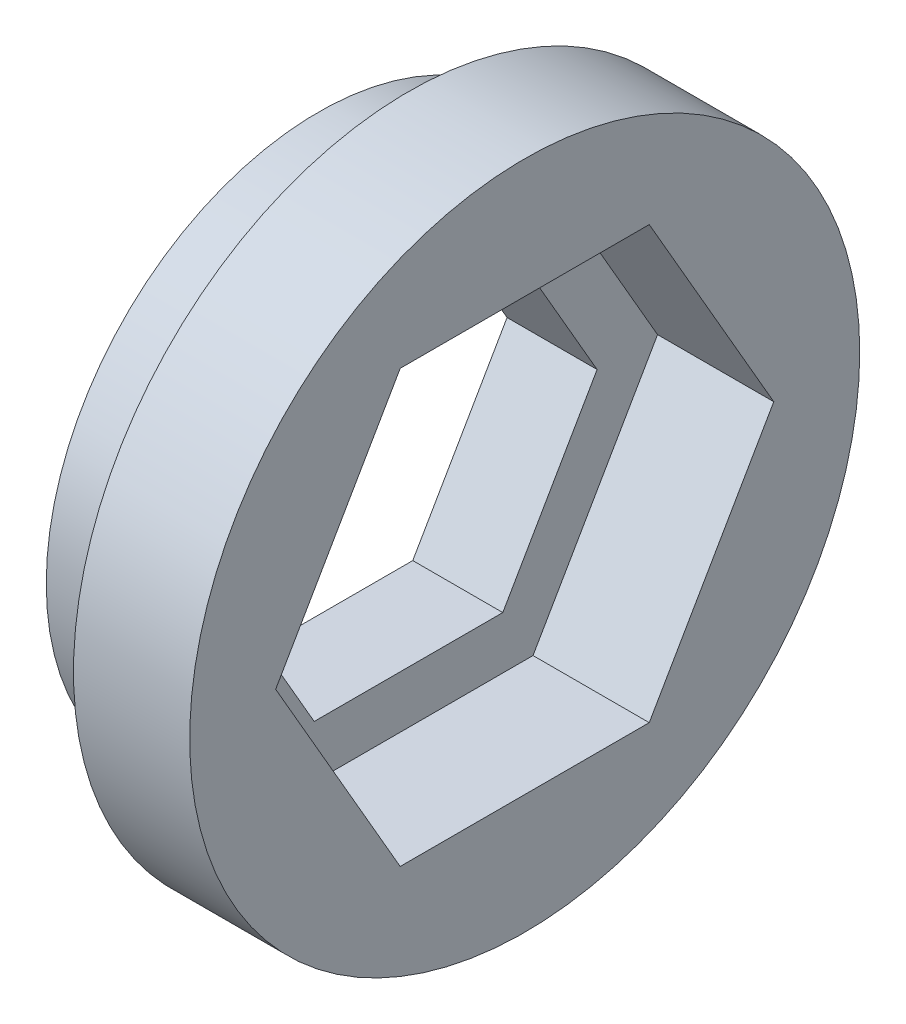
ISO-10303-21;
HEADER;
FILE_DESCRIPTION(('STEP AP214'),'2;1');
FILE_NAME('part.step','',(''),(''),'','','');
FILE_SCHEMA(('AUTOMOTIVE_DESIGN { 1 0 10303 214 1 1 1 1 }'));
ENDSEC;
DATA;
#1=APPLICATION_CONTEXT('core data for automotive mechanical design processes');
#2=APPLICATION_PROTOCOL_DEFINITION('international standard','automotive_design',2000,#1);
#3=PRODUCT_CONTEXT('',#1,'mechanical');
#4=PRODUCT('Part','Part','',(#3));
#5=PRODUCT_RELATED_PRODUCT_CATEGORY('part','',(#4));
#6=PRODUCT_DEFINITION_FORMATION('','',#4);
#7=PRODUCT_DEFINITION_CONTEXT('part definition',#1,'design');
#8=PRODUCT_DEFINITION('design','',#6,#7);
#9=PRODUCT_DEFINITION_SHAPE('','',#8);
#10=(LENGTH_UNIT() NAMED_UNIT(*) SI_UNIT(.MILLI.,.METRE.));
#11=(NAMED_UNIT(*) PLANE_ANGLE_UNIT() SI_UNIT($,.RADIAN.));
#12=(NAMED_UNIT(*) SI_UNIT($,.STERADIAN.) SOLID_ANGLE_UNIT());
#13=UNCERTAINTY_MEASURE_WITH_UNIT(LENGTH_MEASURE(1.E-05),#10,'distance_accuracy_value','');
#14=(GEOMETRIC_REPRESENTATION_CONTEXT(3) GLOBAL_UNCERTAINTY_ASSIGNED_CONTEXT((#13)) GLOBAL_UNIT_ASSIGNED_CONTEXT((#10,
#11,#12)) REPRESENTATION_CONTEXT('',''));
#15=CARTESIAN_POINT('',(0.,0.,0.));
#16=DIRECTION('',(0.,0.,1.));
#17=DIRECTION('',(1.,0.,0.));
#18=AXIS2_PLACEMENT_3D('',#15,#16,#17);
#19=CARTESIAN_POINT('',(1.762125,0.,0.));
#20=DIRECTION('',(1.,0.,0.));
#21=DIRECTION('',(0.,0.,-1.));
#22=AXIS2_PLACEMENT_3D('',#19,#20,#21);
#23=PLANE('',#22);
#24=CARTESIAN_POINT('',(1.762125,0.,0.));
#25=DIRECTION('',(1.,0.,0.));
#26=DIRECTION('',(0.,0.,-1.));
#27=AXIS2_PLACEMENT_3D('',#24,#25,#26);
#28=CIRCLE('',#27,10.16);
#29=CARTESIAN_POINT('',(1.762125,0.,-10.16));
#30=VERTEX_POINT('',#29);
#31=EDGE_CURVE('E147',#30,#30,#28,.T.);
#32=ORIENTED_EDGE('',*,*,#31,.T.);
#33=EDGE_LOOP('',(#32));
#34=FACE_BOUND('',#33,.T.);
#35=DIRECTION('',(0.,0.866025403784439,0.5));
#36=VECTOR('',#35,1.);
#37=CARTESIAN_POINT('',(1.762125,0.,-7.55231887126949));
#38=LINE('',#37,#36);
#39=CARTESIAN_POINT('',(1.762125,0.,-7.55231887126949));
#40=VERTEX_POINT('',#39);
#41=CARTESIAN_POINT('',(1.762125,6.5405,-3.77615943563475));
#42=VERTEX_POINT('',#41);
#43=EDGE_CURVE('E106',#40,#42,#38,.T.);
#44=ORIENTED_EDGE('',*,*,#43,.F.);
#45=DIRECTION('',(0.,0.866025403784439,-0.5));
#46=VECTOR('',#45,1.);
#47=CARTESIAN_POINT('',(1.762125,-6.5405,-3.77615943563475));
#48=LINE('',#47,#46);
#49=CARTESIAN_POINT('',(1.762125,-6.5405,-3.77615943563475));
#50=VERTEX_POINT('',#49);
#51=EDGE_CURVE('E85',#50,#40,#48,.T.);
#52=ORIENTED_EDGE('',*,*,#51,.F.);
#53=DIRECTION('',(0.,0.,-1.));
#54=VECTOR('',#53,1.);
#55=CARTESIAN_POINT('',(1.762125,-6.5405,3.77615943563475));
#56=LINE('',#55,#54);
#57=CARTESIAN_POINT('',(1.762125,-6.5405,3.77615943563475));
#58=VERTEX_POINT('',#57);
#59=EDGE_CURVE('E56',#58,#50,#56,.T.);
#60=ORIENTED_EDGE('',*,*,#59,.F.);
#61=DIRECTION('',(0.,-0.866025403784439,-0.5));
#62=VECTOR('',#61,1.);
#63=CARTESIAN_POINT('',(1.762125,0.,7.5523188712695));
#64=LINE('',#63,#62);
#65=CARTESIAN_POINT('',(1.762125,0.,7.5523188712695));
#66=VERTEX_POINT('',#65);
#67=EDGE_CURVE('E117',#66,#58,#64,.T.);
#68=ORIENTED_EDGE('',*,*,#67,.F.);
#69=DIRECTION('',(0.,-0.866025403784439,0.5));
#70=VECTOR('',#69,1.);
#71=CARTESIAN_POINT('',(1.762125,6.5405,3.77615943563475));
#72=LINE('',#71,#70);
#73=CARTESIAN_POINT('',(1.762125,6.5405,3.77615943563475));
#74=VERTEX_POINT('',#73);
#75=EDGE_CURVE('E105',#74,#66,#72,.T.);
#76=ORIENTED_EDGE('',*,*,#75,.F.);
#77=DIRECTION('',(0.,0.,1.));
#78=VECTOR('',#77,1.);
#79=CARTESIAN_POINT('',(1.762125,6.5405,-3.77615943563475));
#80=LINE('',#79,#78);
#81=EDGE_CURVE('E95',#42,#74,#80,.T.);
#82=ORIENTED_EDGE('',*,*,#81,.F.);
#83=EDGE_LOOP('',(#44,#52,#60,#68,#76,#82));
#84=FACE_BOUND('',#83,.T.);
#85=ADVANCED_FACE('F35',(#34,#84),#23,.T.);
#86=CARTESIAN_POINT('',(-1.762125,0.,0.));
#87=DIRECTION('',(1.,0.,0.));
#88=DIRECTION('',(0.,0.,-1.));
#89=AXIS2_PLACEMENT_3D('',#86,#87,#88);
#90=PLANE('',#89);
#91=CARTESIAN_POINT('',(-1.762125,0.,0.));
#92=DIRECTION('',(1.,0.,0.));
#93=DIRECTION('',(0.,0.,-1.));
#94=AXIS2_PLACEMENT_3D('',#91,#92,#93);
#95=CIRCLE('',#94,9.525);
#96=CARTESIAN_POINT('',(-1.762125,0.,-9.525));
#97=VERTEX_POINT('',#96);
#98=EDGE_CURVE('E11',#97,#97,#95,.T.);
#99=ORIENTED_EDGE('',*,*,#98,.T.);
#100=EDGE_LOOP('',(#99));
#101=FACE_BOUND('',#100,.T.);
#102=CARTESIAN_POINT('',(-1.762125,0.,0.));
#103=DIRECTION('',(1.,0.,0.));
#104=DIRECTION('',(0.,0.,-1.));
#105=AXIS2_PLACEMENT_3D('',#102,#103,#104);
#106=CIRCLE('',#105,10.16);
#107=CARTESIAN_POINT('',(-1.762125,0.,-10.16));
#108=VERTEX_POINT('',#107);
#109=EDGE_CURVE('E146',#108,#108,#106,.T.);
#110=ORIENTED_EDGE('',*,*,#109,.F.);
#111=EDGE_LOOP('',(#110));
#112=FACE_BOUND('',#111,.T.);
#113=ADVANCED_FACE('F168',(#101,#112),#90,.F.);
#114=CARTESIAN_POINT('',(1.762125,0.,0.));
#115=DIRECTION('',(-1.,0.,0.));
#116=DIRECTION('',(0.,0.,1.));
#117=AXIS2_PLACEMENT_3D('',#114,#115,#116);
#118=CYLINDRICAL_SURFACE('',#117,10.16);
#119=ORIENTED_EDGE('',*,*,#31,.F.);
#120=EDGE_LOOP('',(#119));
#121=FACE_BOUND('',#120,.T.);
#122=ORIENTED_EDGE('',*,*,#109,.T.);
#123=EDGE_LOOP('',(#122));
#124=FACE_BOUND('',#123,.T.);
#125=ADVANCED_FACE('F174',(#121,#124),#118,.T.);
#126=CARTESIAN_POINT('',(1.762125,-6.5405,-3.77615943563475));
#127=DIRECTION('',(0.,0.5,0.866025403784439));
#128=DIRECTION('',(0.,-0.866025403784439,0.5));
#129=AXIS2_PLACEMENT_3D('',#126,#127,#128);
#130=PLANE('',#129);
#131=DIRECTION('',(0.,0.866025403784439,-0.5));
#132=VECTOR('',#131,1.);
#133=CARTESIAN_POINT('',(-1.762125,-6.5405,-3.77615943563475));
#134=LINE('',#133,#132);
#135=CARTESIAN_POINT('',(-1.762125,-6.5405,-3.77615943563475));
#136=VERTEX_POINT('',#135);
#137=CARTESIAN_POINT('',(-1.762125,0.,-7.55231887126949));
#138=VERTEX_POINT('',#137);
#139=EDGE_CURVE('E124',#136,#138,#134,.T.);
#140=ORIENTED_EDGE('',*,*,#139,.F.);
#141=DIRECTION('',(-1.,0.,0.));
#142=VECTOR('',#141,1.);
#143=CARTESIAN_POINT('',(1.762125,-6.5405,-3.77615943563475));
#144=LINE('',#143,#142);
#145=EDGE_CURVE('E123',#50,#136,#144,.T.);
#146=ORIENTED_EDGE('',*,*,#145,.F.);
#147=ORIENTED_EDGE('',*,*,#51,.T.);
#148=DIRECTION('',(-1.,0.,0.));
#149=VECTOR('',#148,1.);
#150=CARTESIAN_POINT('',(1.762125,0.,-7.55231887126949));
#151=LINE('',#150,#149);
#152=EDGE_CURVE('E144',#40,#138,#151,.T.);
#153=ORIENTED_EDGE('',*,*,#152,.T.);
#154=EDGE_LOOP('',(#140,#146,#147,#153));
#155=FACE_BOUND('',#154,.T.);
#156=ADVANCED_FACE('F178',(#155),#130,.T.);
#157=CARTESIAN_POINT('',(1.762125,0.,-7.55231887126949));
#158=DIRECTION('',(0.,-0.5,0.866025403784438));
#159=DIRECTION('',(0.,-0.866025403784439,-0.5));
#160=AXIS2_PLACEMENT_3D('',#157,#158,#159);
#161=PLANE('',#160);
#162=DIRECTION('',(0.,0.866025403784439,0.5));
#163=VECTOR('',#162,1.);
#164=CARTESIAN_POINT('',(-1.762125,0.,-7.55231887126949));
#165=LINE('',#164,#163);
#166=CARTESIAN_POINT('',(-1.762125,6.5405,-3.77615943563475));
#167=VERTEX_POINT('',#166);
#168=EDGE_CURVE('E127',#138,#167,#165,.T.);
#169=ORIENTED_EDGE('',*,*,#168,.F.);
#170=ORIENTED_EDGE('',*,*,#152,.F.);
#171=ORIENTED_EDGE('',*,*,#43,.T.);
#172=DIRECTION('',(-1.,0.,0.));
#173=VECTOR('',#172,1.);
#174=CARTESIAN_POINT('',(1.762125,6.5405,-3.77615943563475));
#175=LINE('',#174,#173);
#176=EDGE_CURVE('E101',#42,#167,#175,.T.);
#177=ORIENTED_EDGE('',*,*,#176,.T.);
#178=EDGE_LOOP('',(#169,#170,#171,#177));
#179=FACE_BOUND('',#178,.T.);
#180=ADVANCED_FACE('F185',(#179),#161,.T.);
#181=CARTESIAN_POINT('',(1.762125,6.5405,-3.77615943563475));
#182=DIRECTION('',(0.,-1.,0.));
#183=DIRECTION('',(0.,0.,-1.));
#184=AXIS2_PLACEMENT_3D('',#181,#182,#183);
#185=PLANE('',#184);
#186=DIRECTION('',(0.,0.,1.));
#187=VECTOR('',#186,1.);
#188=CARTESIAN_POINT('',(-1.762125,6.5405,-3.77615943563475));
#189=LINE('',#188,#187);
#190=CARTESIAN_POINT('',(-1.762125,6.5405,3.77615943563475));
#191=VERTEX_POINT('',#190);
#192=EDGE_CURVE('E131',#167,#191,#189,.T.);
#193=ORIENTED_EDGE('',*,*,#192,.F.);
#194=ORIENTED_EDGE('',*,*,#176,.F.);
#195=ORIENTED_EDGE('',*,*,#81,.T.);
#196=DIRECTION('',(-1.,0.,0.));
#197=VECTOR('',#196,1.);
#198=CARTESIAN_POINT('',(1.762125,6.5405,3.77615943563475));
#199=LINE('',#198,#197);
#200=EDGE_CURVE('E99',#74,#191,#199,.T.);
#201=ORIENTED_EDGE('',*,*,#200,.T.);
#202=EDGE_LOOP('',(#193,#194,#195,#201));
#203=FACE_BOUND('',#202,.T.);
#204=ADVANCED_FACE('F98',(#203),#185,.T.);
#205=CARTESIAN_POINT('',(1.762125,6.5405,3.77615943563475));
#206=DIRECTION('',(0.,-0.5,-0.866025403784439));
#207=DIRECTION('',(0.,0.866025403784439,-0.5));
#208=AXIS2_PLACEMENT_3D('',#205,#206,#207);
#209=PLANE('',#208);
#210=DIRECTION('',(0.,-0.866025403784439,0.5));
#211=VECTOR('',#210,1.);
#212=CARTESIAN_POINT('',(-1.762125,6.5405,3.77615943563475));
#213=LINE('',#212,#211);
#214=CARTESIAN_POINT('',(-1.762125,0.,7.5523188712695));
#215=VERTEX_POINT('',#214);
#216=EDGE_CURVE('E112',#191,#215,#213,.T.);
#217=ORIENTED_EDGE('',*,*,#216,.F.);
#218=ORIENTED_EDGE('',*,*,#200,.F.);
#219=ORIENTED_EDGE('',*,*,#75,.T.);
#220=DIRECTION('',(-1.,0.,0.));
#221=VECTOR('',#220,1.);
#222=CARTESIAN_POINT('',(1.762125,0.,7.5523188712695));
#223=LINE('',#222,#221);
#224=EDGE_CURVE('E114',#66,#215,#223,.T.);
#225=ORIENTED_EDGE('',*,*,#224,.T.);
#226=EDGE_LOOP('',(#217,#218,#219,#225));
#227=FACE_BOUND('',#226,.T.);
#228=ADVANCED_FACE('F109',(#227),#209,.T.);
#229=CARTESIAN_POINT('',(1.762125,0.,7.5523188712695));
#230=DIRECTION('',(0.,0.5,-0.866025403784439));
#231=DIRECTION('',(0.,0.866025403784439,0.5));
#232=AXIS2_PLACEMENT_3D('',#229,#230,#231);
#233=PLANE('',#232);
#234=DIRECTION('',(0.,-0.866025403784439,-0.5));
#235=VECTOR('',#234,1.);
#236=CARTESIAN_POINT('',(-1.762125,0.,7.5523188712695));
#237=LINE('',#236,#235);
#238=CARTESIAN_POINT('',(-1.762125,-6.5405,3.77615943563475));
#239=VERTEX_POINT('',#238);
#240=EDGE_CURVE('E134',#215,#239,#237,.T.);
#241=ORIENTED_EDGE('',*,*,#240,.F.);
#242=ORIENTED_EDGE('',*,*,#224,.F.);
#243=ORIENTED_EDGE('',*,*,#67,.T.);
#244=DIRECTION('',(-1.,0.,0.));
#245=VECTOR('',#244,1.);
#246=CARTESIAN_POINT('',(1.762125,-6.5405,3.77615943563475));
#247=LINE('',#246,#245);
#248=EDGE_CURVE('E50',#58,#239,#247,.T.);
#249=ORIENTED_EDGE('',*,*,#248,.T.);
#250=EDGE_LOOP('',(#241,#242,#243,#249));
#251=FACE_BOUND('',#250,.T.);
#252=ADVANCED_FACE('F202',(#251),#233,.T.);
#253=CARTESIAN_POINT('',(1.762125,-6.5405,3.77615943563475));
#254=DIRECTION('',(0.,1.,0.));
#255=DIRECTION('',(0.,0.,1.));
#256=AXIS2_PLACEMENT_3D('',#253,#254,#255);
#257=PLANE('',#256);
#258=DIRECTION('',(0.,0.,-1.));
#259=VECTOR('',#258,1.);
#260=CARTESIAN_POINT('',(-1.762125,-6.5405,3.77615943563475));
#261=LINE('',#260,#259);
#262=EDGE_CURVE('E137',#239,#136,#261,.T.);
#263=ORIENTED_EDGE('',*,*,#262,.F.);
#264=ORIENTED_EDGE('',*,*,#248,.F.);
#265=ORIENTED_EDGE('',*,*,#59,.T.);
#266=ORIENTED_EDGE('',*,*,#145,.T.);
#267=EDGE_LOOP('',(#263,#264,#265,#266));
#268=FACE_BOUND('',#267,.T.);
#269=ADVANCED_FACE('F199',(#268),#257,.T.);
#270=CARTESIAN_POINT('',(-4.492625,0.,0.));
#271=DIRECTION('',(-1.,0.,0.));
#272=DIRECTION('',(0.,0.,1.));
#273=AXIS2_PLACEMENT_3D('',#270,#271,#272);
#274=PLANE('',#273);
#275=CARTESIAN_POINT('',(-4.492625,0.,0.));
#276=DIRECTION('',(-1.,0.,0.));
#277=DIRECTION('',(0.,0.,1.));
#278=AXIS2_PLACEMENT_3D('',#275,#276,#277);
#279=CIRCLE('',#278,8.255);
#280=CARTESIAN_POINT('',(-4.492625,0.,8.255));
#281=VERTEX_POINT('',#280);
#282=EDGE_CURVE('E128',#281,#281,#279,.T.);
#283=ORIENTED_EDGE('',*,*,#282,.T.);
#284=EDGE_LOOP('',(#283));
#285=FACE_BOUND('',#284,.T.);
#286=DIRECTION('',(0.,0.866025403784438,-0.5));
#287=VECTOR('',#286,1.);
#288=CARTESIAN_POINT('',(-4.492625,0.,5.71923176659243));
#289=LINE('',#288,#287);
#290=CARTESIAN_POINT('',(-4.492625,0.,5.71923176659243));
#291=VERTEX_POINT('',#290);
#292=CARTESIAN_POINT('',(-4.492625,4.953,2.85961588329622));
#293=VERTEX_POINT('',#292);
#294=EDGE_CURVE('E402',#291,#293,#289,.T.);
#295=ORIENTED_EDGE('',*,*,#294,.F.);
#296=DIRECTION('',(0.,0.866025403784439,0.5));
#297=VECTOR('',#296,1.);
#298=CARTESIAN_POINT('',(-4.492625,-4.953,2.85961588329622));
#299=LINE('',#298,#297);
#300=CARTESIAN_POINT('',(-4.492625,-4.953,2.85961588329622));
#301=VERTEX_POINT('',#300);
#302=EDGE_CURVE('E377',#301,#291,#299,.T.);
#303=ORIENTED_EDGE('',*,*,#302,.F.);
#304=DIRECTION('',(0.,0.,1.));
#305=VECTOR('',#304,1.);
#306=CARTESIAN_POINT('',(-4.492625,-4.953,-2.85961588329622));
#307=LINE('',#306,#305);
#308=CARTESIAN_POINT('',(-4.492625,-4.953,-2.85961588329622));
#309=VERTEX_POINT('',#308);
#310=EDGE_CURVE('E381',#309,#301,#307,.T.);
#311=ORIENTED_EDGE('',*,*,#310,.F.);
#312=DIRECTION('',(0.,-0.866025403784439,0.5));
#313=VECTOR('',#312,1.);
#314=CARTESIAN_POINT('',(-4.492625,0.,-5.71923176659243));
#315=LINE('',#314,#313);
#316=CARTESIAN_POINT('',(-4.492625,0.,-5.71923176659243));
#317=VERTEX_POINT('',#316);
#318=EDGE_CURVE('E420',#317,#309,#315,.T.);
#319=ORIENTED_EDGE('',*,*,#318,.F.);
#320=DIRECTION('',(0.,-0.866025403784439,-0.5));
#321=VECTOR('',#320,1.);
#322=CARTESIAN_POINT('',(-4.492625,4.953,-2.85961588329622));
#323=LINE('',#322,#321);
#324=CARTESIAN_POINT('',(-4.492625,4.953,-2.85961588329622));
#325=VERTEX_POINT('',#324);
#326=EDGE_CURVE('E414',#325,#317,#323,.T.);
#327=ORIENTED_EDGE('',*,*,#326,.F.);
#328=DIRECTION('',(0.,0.,-1.));
#329=VECTOR('',#328,1.);
#330=CARTESIAN_POINT('',(-4.492625,4.953,2.85961588329622));
#331=LINE('',#330,#329);
#332=EDGE_CURVE('E409',#293,#325,#331,.T.);
#333=ORIENTED_EDGE('',*,*,#332,.F.);
#334=EDGE_LOOP('',(#295,#303,#311,#319,#327,#333));
#335=FACE_BOUND('',#334,.T.);
#336=ADVANCED_FACE('F201',(#285,#335),#274,.T.);
#337=CARTESIAN_POINT('',(-1.762125,0.,0.));
#338=DIRECTION('',(-1.,0.,0.));
#339=DIRECTION('',(0.,0.,1.));
#340=AXIS2_PLACEMENT_3D('',#337,#338,#339);
#341=PLANE('',#340);
#342=ORIENTED_EDGE('',*,*,#139,.T.);
#343=ORIENTED_EDGE('',*,*,#168,.T.);
#344=ORIENTED_EDGE('',*,*,#192,.T.);
#345=ORIENTED_EDGE('',*,*,#216,.T.);
#346=ORIENTED_EDGE('',*,*,#240,.T.);
#347=ORIENTED_EDGE('',*,*,#262,.T.);
#348=EDGE_LOOP('',(#342,#343,#344,#345,#346,#347));
#349=FACE_BOUND('',#348,.T.);
#350=DIRECTION('',(0.,0.866025403784439,0.5));
#351=VECTOR('',#350,1.);
#352=CARTESIAN_POINT('',(-1.762125,-4.953,2.85961588329622));
#353=LINE('',#352,#351);
#354=CARTESIAN_POINT('',(-1.762125,-4.953,2.85961588329622));
#355=VERTEX_POINT('',#354);
#356=CARTESIAN_POINT('',(-1.762125,0.,5.71923176659243));
#357=VERTEX_POINT('',#356);
#358=EDGE_CURVE('E424',#355,#357,#353,.T.);
#359=ORIENTED_EDGE('',*,*,#358,.T.);
#360=DIRECTION('',(0.,0.866025403784438,-0.5));
#361=VECTOR('',#360,1.);
#362=CARTESIAN_POINT('',(-1.762125,0.,5.71923176659243));
#363=LINE('',#362,#361);
#364=CARTESIAN_POINT('',(-1.762125,4.953,2.85961588329622));
#365=VERTEX_POINT('',#364);
#366=EDGE_CURVE('E372',#357,#365,#363,.T.);
#367=ORIENTED_EDGE('',*,*,#366,.T.);
#368=DIRECTION('',(0.,0.,-1.));
#369=VECTOR('',#368,1.);
#370=CARTESIAN_POINT('',(-1.762125,4.953,2.85961588329622));
#371=LINE('',#370,#369);
#372=CARTESIAN_POINT('',(-1.762125,4.953,-2.85961588329622));
#373=VERTEX_POINT('',#372);
#374=EDGE_CURVE('E369',#365,#373,#371,.T.);
#375=ORIENTED_EDGE('',*,*,#374,.T.);
#376=DIRECTION('',(0.,-0.866025403784439,-0.5));
#377=VECTOR('',#376,1.);
#378=CARTESIAN_POINT('',(-1.762125,4.953,-2.85961588329622));
#379=LINE('',#378,#377);
#380=CARTESIAN_POINT('',(-1.762125,0.,-5.71923176659243));
#381=VERTEX_POINT('',#380);
#382=EDGE_CURVE('E362',#373,#381,#379,.T.);
#383=ORIENTED_EDGE('',*,*,#382,.T.);
#384=DIRECTION('',(0.,-0.866025403784439,0.5));
#385=VECTOR('',#384,1.);
#386=CARTESIAN_POINT('',(-1.762125,0.,-5.71923176659243));
#387=LINE('',#386,#385);
#388=CARTESIAN_POINT('',(-1.762125,-4.953,-2.85961588329622));
#389=VERTEX_POINT('',#388);
#390=EDGE_CURVE('E347',#381,#389,#387,.T.);
#391=ORIENTED_EDGE('',*,*,#390,.T.);
#392=DIRECTION('',(0.,0.,1.));
#393=VECTOR('',#392,1.);
#394=CARTESIAN_POINT('',(-1.762125,-4.953,-2.85961588329622));
#395=LINE('',#394,#393);
#396=EDGE_CURVE('E361',#389,#355,#395,.T.);
#397=ORIENTED_EDGE('',*,*,#396,.T.);
#398=EDGE_LOOP('',(#359,#367,#375,#383,#391,#397));
#399=FACE_BOUND('',#398,.T.);
#400=ADVANCED_FACE('F197',(#349,#399),#341,.F.);
#401=CARTESIAN_POINT('',(-4.492625,0.,0.));
#402=DIRECTION('',(1.,0.,0.));
#403=DIRECTION('',(0.,0.,-1.));
#404=AXIS2_PLACEMENT_3D('',#401,#402,#403);
#405=CYLINDRICAL_SURFACE('',#404,8.255);
#406=CARTESIAN_POINT('',(-3.032125,0.,0.));
#407=DIRECTION('',(1.,0.,0.));
#408=DIRECTION('',(0.,0.,-1.));
#409=AXIS2_PLACEMENT_3D('',#406,#407,#408);
#410=CIRCLE('',#409,8.255);
#411=CARTESIAN_POINT('',(-3.032125,0.,-8.255));
#412=VERTEX_POINT('',#411);
#413=EDGE_CURVE('E43',#412,#412,#410,.F.);
#414=ORIENTED_EDGE('',*,*,#413,.T.);
#415=EDGE_LOOP('',(#414));
#416=FACE_BOUND('',#415,.T.);
#417=ORIENTED_EDGE('',*,*,#282,.F.);
#418=EDGE_LOOP('',(#417));
#419=FACE_BOUND('',#418,.T.);
#420=ADVANCED_FACE('F154',(#416,#419),#405,.T.);
#421=CARTESIAN_POINT('',(-4.492625,-4.953,2.85961588329622));
#422=DIRECTION('',(0.,0.5,-0.866025403784439));
#423=DIRECTION('',(0.,0.866025403784439,0.5));
#424=AXIS2_PLACEMENT_3D('',#421,#422,#423);
#425=PLANE('',#424);
#426=ORIENTED_EDGE('',*,*,#358,.F.);
#427=DIRECTION('',(1.,0.,0.));
#428=VECTOR('',#427,1.);
#429=CARTESIAN_POINT('',(-4.492625,-4.953,2.85961588329622));
#430=LINE('',#429,#428);
#431=EDGE_CURVE('E378',#301,#355,#430,.T.);
#432=ORIENTED_EDGE('',*,*,#431,.F.);
#433=ORIENTED_EDGE('',*,*,#302,.T.);
#434=DIRECTION('',(1.,0.,0.));
#435=VECTOR('',#434,1.);
#436=CARTESIAN_POINT('',(-4.492625,0.,5.71923176659243));
#437=LINE('',#436,#435);
#438=EDGE_CURVE('E390',#291,#357,#437,.T.);
#439=ORIENTED_EDGE('',*,*,#438,.T.);
#440=EDGE_LOOP('',(#426,#432,#433,#439));
#441=FACE_BOUND('',#440,.T.);
#442=ADVANCED_FACE('F253',(#441),#425,.T.);
#443=CARTESIAN_POINT('',(-4.492625,0.,5.71923176659243));
#444=DIRECTION('',(0.,-0.5,-0.866025403784438));
#445=DIRECTION('',(0.,0.866025403784439,-0.5));
#446=AXIS2_PLACEMENT_3D('',#443,#444,#445);
#447=PLANE('',#446);
#448=ORIENTED_EDGE('',*,*,#366,.F.);
#449=ORIENTED_EDGE('',*,*,#438,.F.);
#450=ORIENTED_EDGE('',*,*,#294,.T.);
#451=DIRECTION('',(1.,0.,0.));
#452=VECTOR('',#451,1.);
#453=CARTESIAN_POINT('',(-4.492625,4.953,2.85961588329622));
#454=LINE('',#453,#452);
#455=EDGE_CURVE('E387',#293,#365,#454,.T.);
#456=ORIENTED_EDGE('',*,*,#455,.T.);
#457=EDGE_LOOP('',(#448,#449,#450,#456));
#458=FACE_BOUND('',#457,.T.);
#459=ADVANCED_FACE('F258',(#458),#447,.T.);
#460=CARTESIAN_POINT('',(-4.492625,4.953,2.85961588329622));
#461=DIRECTION('',(0.,-1.,0.));
#462=DIRECTION('',(0.,0.,-1.));
#463=AXIS2_PLACEMENT_3D('',#460,#461,#462);
#464=PLANE('',#463);
#465=ORIENTED_EDGE('',*,*,#374,.F.);
#466=ORIENTED_EDGE('',*,*,#455,.F.);
#467=ORIENTED_EDGE('',*,*,#332,.T.);
#468=DIRECTION('',(1.,0.,0.));
#469=VECTOR('',#468,1.);
#470=CARTESIAN_POINT('',(-4.492625,4.953,-2.85961588329622));
#471=LINE('',#470,#469);
#472=EDGE_CURVE('E384',#325,#373,#471,.T.);
#473=ORIENTED_EDGE('',*,*,#472,.T.);
#474=EDGE_LOOP('',(#465,#466,#467,#473));
#475=FACE_BOUND('',#474,.T.);
#476=ADVANCED_FACE('F268',(#475),#464,.T.);
#477=CARTESIAN_POINT('',(-4.492625,4.953,-2.85961588329622));
#478=DIRECTION('',(0.,-0.5,0.866025403784439));
#479=DIRECTION('',(0.,-0.866025403784439,-0.5));
#480=AXIS2_PLACEMENT_3D('',#477,#478,#479);
#481=PLANE('',#480);
#482=ORIENTED_EDGE('',*,*,#382,.F.);
#483=ORIENTED_EDGE('',*,*,#472,.F.);
#484=ORIENTED_EDGE('',*,*,#326,.T.);
#485=DIRECTION('',(1.,0.,0.));
#486=VECTOR('',#485,1.);
#487=CARTESIAN_POINT('',(-4.492625,0.,-5.71923176659243));
#488=LINE('',#487,#486);
#489=EDGE_CURVE('E352',#317,#381,#488,.T.);
#490=ORIENTED_EDGE('',*,*,#489,.T.);
#491=EDGE_LOOP('',(#482,#483,#484,#490));
#492=FACE_BOUND('',#491,.T.);
#493=ADVANCED_FACE('F278',(#492),#481,.T.);
#494=CARTESIAN_POINT('',(-4.492625,0.,-5.71923176659243));
#495=DIRECTION('',(0.,0.5,0.866025403784439));
#496=DIRECTION('',(0.,-0.866025403784439,0.5));
#497=AXIS2_PLACEMENT_3D('',#494,#495,#496);
#498=PLANE('',#497);
#499=ORIENTED_EDGE('',*,*,#390,.F.);
#500=ORIENTED_EDGE('',*,*,#489,.F.);
#501=ORIENTED_EDGE('',*,*,#318,.T.);
#502=DIRECTION('',(1.,0.,0.));
#503=VECTOR('',#502,1.);
#504=CARTESIAN_POINT('',(-4.492625,-4.953,-2.85961588329622));
#505=LINE('',#504,#503);
#506=EDGE_CURVE('E356',#309,#389,#505,.T.);
#507=ORIENTED_EDGE('',*,*,#506,.T.);
#508=EDGE_LOOP('',(#499,#500,#501,#507));
#509=FACE_BOUND('',#508,.T.);
#510=ADVANCED_FACE('F163',(#509),#498,.T.);
#511=CARTESIAN_POINT('',(-4.492625,-4.953,-2.85961588329622));
#512=DIRECTION('',(0.,1.,0.));
#513=DIRECTION('',(0.,0.,1.));
#514=AXIS2_PLACEMENT_3D('',#511,#512,#513);
#515=PLANE('',#514);
#516=ORIENTED_EDGE('',*,*,#396,.F.);
#517=ORIENTED_EDGE('',*,*,#506,.F.);
#518=ORIENTED_EDGE('',*,*,#310,.T.);
#519=ORIENTED_EDGE('',*,*,#431,.T.);
#520=EDGE_LOOP('',(#516,#517,#518,#519));
#521=FACE_BOUND('',#520,.T.);
#522=ADVANCED_FACE('F158',(#521),#515,.T.);
#523=CARTESIAN_POINT('',(-3.032125,0.,0.));
#524=DIRECTION('',(1.,0.,0.));
#525=DIRECTION('',(0.,0.,-1.));
#526=AXIS2_PLACEMENT_3D('',#523,#524,#525);
#527=TOROIDAL_SURFACE('',#526,9.525,1.27);
#528=ORIENTED_EDGE('',*,*,#98,.F.);
#529=EDGE_LOOP('',(#528));
#530=FACE_BOUND('',#529,.T.);
#531=ORIENTED_EDGE('',*,*,#413,.F.);
#532=EDGE_LOOP('',(#531));
#533=FACE_BOUND('',#532,.T.);
#534=ADVANCED_FACE('F37',(#530,#533),#527,.F.);
#535=CLOSED_SHELL('',(#85,#113,#125,#156,#180,#204,#228,#252,#269,#336,#400,#420,#442,#459,#476,
#493,#510,#522,#534));
#536=MANIFOLD_SOLID_BREP('B2',#535);
#537=ADVANCED_BREP_SHAPE_REPRESENTATION('',(#18,#536),#14);
#538=SHAPE_DEFINITION_REPRESENTATION(#9,#537);
ENDSEC;
END-ISO-10303-21;
